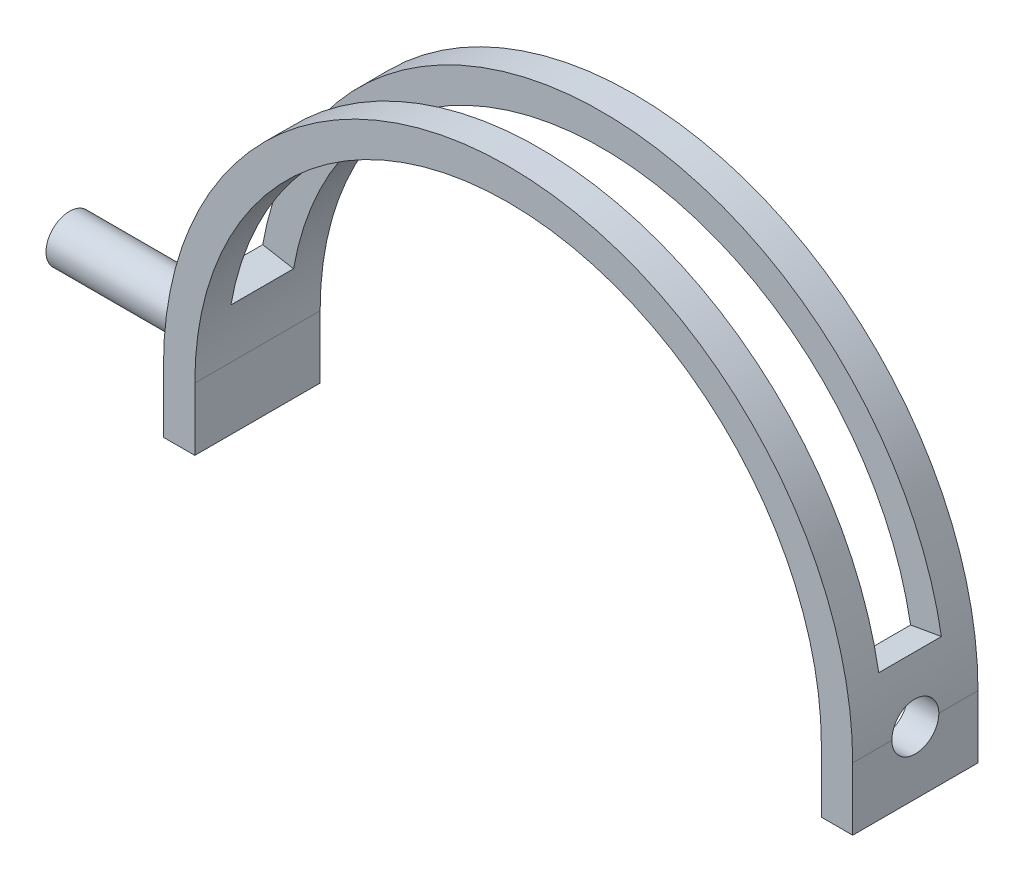
ISO-10303-21;
HEADER;
FILE_DESCRIPTION(('STEP AP214'),'2;1');
FILE_NAME('part.step','',(''),(''),'','','');
FILE_SCHEMA(('AUTOMOTIVE_DESIGN { 1 0 10303 214 1 1 1 1 }'));
ENDSEC;
DATA;
#1=APPLICATION_CONTEXT('core data for automotive mechanical design processes');
#2=APPLICATION_PROTOCOL_DEFINITION('international standard','automotive_design',2000,#1);
#3=PRODUCT_CONTEXT('',#1,'mechanical');
#4=PRODUCT('Part','Part','',(#3));
#5=PRODUCT_RELATED_PRODUCT_CATEGORY('part','',(#4));
#6=PRODUCT_DEFINITION_FORMATION('','',#4);
#7=PRODUCT_DEFINITION_CONTEXT('part definition',#1,'design');
#8=PRODUCT_DEFINITION('design','',#6,#7);
#9=PRODUCT_DEFINITION_SHAPE('','',#8);
#10=(LENGTH_UNIT() NAMED_UNIT(*) SI_UNIT(.MILLI.,.METRE.));
#11=(NAMED_UNIT(*) PLANE_ANGLE_UNIT() SI_UNIT($,.RADIAN.));
#12=(NAMED_UNIT(*) SI_UNIT($,.STERADIAN.) SOLID_ANGLE_UNIT());
#13=UNCERTAINTY_MEASURE_WITH_UNIT(LENGTH_MEASURE(1.E-05),#10,'distance_accuracy_value','');
#14=(GEOMETRIC_REPRESENTATION_CONTEXT(3) GLOBAL_UNCERTAINTY_ASSIGNED_CONTEXT((#13)) GLOBAL_UNIT_ASSIGNED_CONTEXT((#10,
#11,#12)) REPRESENTATION_CONTEXT('',''));
#15=CARTESIAN_POINT('',(0.,0.,0.));
#16=DIRECTION('',(0.,0.,1.));
#17=DIRECTION('',(1.,0.,0.));
#18=AXIS2_PLACEMENT_3D('',#15,#16,#17);
#19=CARTESIAN_POINT('',(-50.,-10.,-10.));
#20=DIRECTION('',(1.,0.,0.));
#21=DIRECTION('',(0.,1.,0.));
#22=AXIS2_PLACEMENT_3D('',#19,#20,#21);
#23=PLANE('',#22);
#24=DIRECTION('',(0.,0.,1.));
#25=VECTOR('',#24,1.);
#26=CARTESIAN_POINT('',(-50.,0.,-10.));
#27=LINE('',#26,#25);
#28=CARTESIAN_POINT('',(-50.,0.,-10.));
#29=VERTEX_POINT('',#28);
#30=CARTESIAN_POINT('',(-50.,0.,10.));
#31=VERTEX_POINT('',#30);
#32=EDGE_CURVE('E175',#29,#31,#27,.T.);
#33=ORIENTED_EDGE('',*,*,#32,.T.);
#34=DIRECTION('',(0.,1.,0.));
#35=VECTOR('',#34,1.);
#36=CARTESIAN_POINT('',(-50.,-10.,10.));
#37=LINE('',#36,#35);
#38=CARTESIAN_POINT('',(-50.,-10.,10.));
#39=VERTEX_POINT('',#38);
#40=EDGE_CURVE('E232',#39,#31,#37,.T.);
#41=ORIENTED_EDGE('',*,*,#40,.F.);
#42=DIRECTION('',(0.,0.,1.));
#43=VECTOR('',#42,1.);
#44=CARTESIAN_POINT('',(-50.,-10.,-10.));
#45=LINE('',#44,#43);
#46=CARTESIAN_POINT('',(-50.,-10.,-10.));
#47=VERTEX_POINT('',#46);
#48=EDGE_CURVE('E182',#47,#39,#45,.T.);
#49=ORIENTED_EDGE('',*,*,#48,.F.);
#50=DIRECTION('',(0.,1.,0.));
#51=VECTOR('',#50,1.);
#52=CARTESIAN_POINT('',(-50.,-10.,-10.));
#53=LINE('',#52,#51);
#54=EDGE_CURVE('E256',#47,#29,#53,.T.);
#55=ORIENTED_EDGE('',*,*,#54,.T.);
#56=EDGE_LOOP('',(#33,#41,#49,#55));
#57=FACE_BOUND('',#56,.T.);
#58=ADVANCED_FACE('F34',(#57),#23,.T.);
#59=CARTESIAN_POINT('',(-55.,-10.,-10.));
#60=DIRECTION('',(0.,-1.,0.));
#61=DIRECTION('',(0.,0.,-1.));
#62=AXIS2_PLACEMENT_3D('',#59,#60,#61);
#63=PLANE('',#62);
#64=ORIENTED_EDGE('',*,*,#48,.T.);
#65=DIRECTION('',(1.,0.,0.));
#66=VECTOR('',#65,1.);
#67=CARTESIAN_POINT('',(-55.,-10.,10.));
#68=LINE('',#67,#66);
#69=CARTESIAN_POINT('',(-55.,-10.,10.));
#70=VERTEX_POINT('',#69);
#71=EDGE_CURVE('E253',#70,#39,#68,.T.);
#72=ORIENTED_EDGE('',*,*,#71,.F.);
#73=DIRECTION('',(0.,0.,1.));
#74=VECTOR('',#73,1.);
#75=CARTESIAN_POINT('',(-55.,-10.,-10.));
#76=LINE('',#75,#74);
#77=CARTESIAN_POINT('',(-55.,-10.,-10.));
#78=VERTEX_POINT('',#77);
#79=EDGE_CURVE('E276',#78,#70,#76,.T.);
#80=ORIENTED_EDGE('',*,*,#79,.F.);
#81=DIRECTION('',(1.,0.,0.));
#82=VECTOR('',#81,1.);
#83=CARTESIAN_POINT('',(-55.,-10.,-10.));
#84=LINE('',#83,#82);
#85=EDGE_CURVE('E177',#78,#47,#84,.T.);
#86=ORIENTED_EDGE('',*,*,#85,.T.);
#87=EDGE_LOOP('',(#64,#72,#80,#86));
#88=FACE_BOUND('',#87,.T.);
#89=ADVANCED_FACE('F296',(#88),#63,.T.);
#90=CARTESIAN_POINT('',(-55.,0.,-10.));
#91=DIRECTION('',(-1.,0.,0.));
#92=DIRECTION('',(0.,0.,1.));
#93=AXIS2_PLACEMENT_3D('',#90,#91,#92);
#94=PLANE('',#93);
#95=DIRECTION('',(0.,0.,1.));
#96=VECTOR('',#95,1.);
#97=CARTESIAN_POINT('',(-55.,0.,-10.));
#98=LINE('',#97,#96);
#99=CARTESIAN_POINT('',(-55.,0.,3.75));
#100=VERTEX_POINT('',#99);
#101=CARTESIAN_POINT('',(-55.,0.,10.));
#102=VERTEX_POINT('',#101);
#103=EDGE_CURVE('E160',#100,#102,#98,.T.);
#104=ORIENTED_EDGE('',*,*,#103,.F.);
#105=CARTESIAN_POINT('',(-55.,0.,0.));
#106=DIRECTION('',(-1.,0.,0.));
#107=DIRECTION('',(0.,0.,1.));
#108=AXIS2_PLACEMENT_3D('',#105,#106,#107);
#109=CIRCLE('',#108,3.75);
#110=CARTESIAN_POINT('',(-55.,0.,-3.75));
#111=VERTEX_POINT('',#110);
#112=EDGE_CURVE('E154',#111,#100,#109,.T.);
#113=ORIENTED_EDGE('',*,*,#112,.F.);
#114=CARTESIAN_POINT('',(-55.,0.,-10.));
#115=VERTEX_POINT('',#114);
#116=EDGE_CURVE('E164',#115,#111,#98,.T.);
#117=ORIENTED_EDGE('',*,*,#116,.F.);
#118=DIRECTION('',(0.,-1.,0.));
#119=VECTOR('',#118,1.);
#120=CARTESIAN_POINT('',(-55.,0.,-10.));
#121=LINE('',#120,#119);
#122=EDGE_CURVE('E271',#115,#78,#121,.T.);
#123=ORIENTED_EDGE('',*,*,#122,.T.);
#124=ORIENTED_EDGE('',*,*,#79,.T.);
#125=DIRECTION('',(0.,-1.,0.));
#126=VECTOR('',#125,1.);
#127=CARTESIAN_POINT('',(-55.,0.,10.));
#128=LINE('',#127,#126);
#129=EDGE_CURVE('E250',#102,#70,#128,.T.);
#130=ORIENTED_EDGE('',*,*,#129,.F.);
#131=EDGE_LOOP('',(#104,#113,#117,#123,#124,#130));
#132=FACE_BOUND('',#131,.T.);
#133=ADVANCED_FACE('F289',(#132),#94,.T.);
#134=CARTESIAN_POINT('',(0.,0.,-10.));
#135=DIRECTION('',(0.,0.,1.));
#136=DIRECTION('',(1.,0.,0.));
#137=AXIS2_PLACEMENT_3D('',#134,#135,#136);
#138=CYLINDRICAL_SURFACE('',#137,55.);
#139=CARTESIAN_POINT('',(55.,-1.95399252334028E-13,-3.75));
#140=CARTESIAN_POINT('',(55.0000029367142,0.105342142935318,-3.75001024623835));
#141=CARTESIAN_POINT('',(54.9996974169464,0.210679329031992,-3.74556125983305));
#142=CARTESIAN_POINT('',(54.9984911560112,0.420597692397046,-3.72782413932973));
#143=CARTESIAN_POINT('',(54.9975904484224,0.525178911978168,-3.7145365038797));
#144=CARTESIAN_POINT('',(54.9952164461705,0.732768463109257,-3.67921548066589));
#145=CARTESIAN_POINT('',(54.9937436088666,0.83577798288623,-3.65718907835464));
#146=CARTESIAN_POINT('',(54.9902695969715,1.0395457592481,-3.60457109820449));
#147=CARTESIAN_POINT('',(54.9882684278441,1.14030403910268,-3.57397960894191));
#148=CARTESIAN_POINT('',(54.9815497006618,1.43821968222911,-3.46961207792658));
#149=CARTESIAN_POINT('',(54.9761157415531,1.6311144615404,-3.38322644205145));
#150=CARTESIAN_POINT('',(54.963951772662,1.99952668733934,-3.17942887631531));
#151=CARTESIAN_POINT('',(54.9572219719461,2.17504693006789,-3.0620219501866));
#152=CARTESIAN_POINT('',(54.9432089953261,2.50419161022359,-2.79926858129625));
#153=CARTESIAN_POINT('',(54.9359250240775,2.65778363165163,-2.65388150599399));
#154=CARTESIAN_POINT('',(54.9216307209085,2.93841559287571,-2.33936936328912));
#155=CARTESIAN_POINT('',(54.914620430834,3.06545148507258,-2.17024068382497));
#156=CARTESIAN_POINT('',(54.9016584325678,3.28945974103843,-1.81286154174951));
#157=CARTESIAN_POINT('',(54.8957077258553,3.38640372668274,-1.62459325028223));
#158=CARTESIAN_POINT('',(54.8855472218615,3.54728664535595,-1.23441668760156));
#159=CARTESIAN_POINT('',(54.8813372964711,3.61122800722962,-1.03250942139259));
#160=CARTESIAN_POINT('',(54.8751406395362,3.70420438031895,-0.621107551006494));
#161=CARTESIAN_POINT('',(54.8731504707955,3.73329336411869,-0.411625197340026));
#162=CARTESIAN_POINT('',(54.8716074701609,3.75590582911842,0.00926286808655241));
#163=CARTESIAN_POINT('',(54.8720546662752,3.74942890162516,0.220668601920645));
#164=CARTESIAN_POINT('',(54.8753328587618,3.7011369478326,0.639022415430742));
#165=CARTESIAN_POINT('',(54.87815984068,3.65938143245418,0.845977400499929));
#166=CARTESIAN_POINT('',(54.8858727077681,3.54181004937536,1.24993319922138));
#167=CARTESIAN_POINT('',(54.8907585977356,3.46599410230701,1.4469339896771));
#168=CARTESIAN_POINT('',(54.902043441865,3.28238497913749,1.82558488844642));
#169=CARTESIAN_POINT('',(54.9084437002839,3.17456421825019,2.00722158027716));
#170=CARTESIAN_POINT('',(54.9220343842251,2.93003108367319,2.34983203424323));
#171=CARTESIAN_POINT('',(54.9292247833342,2.79331967561327,2.51080648669624));
#172=CARTESIAN_POINT('',(54.9436025499965,2.49457344691883,2.80785749024394));
#173=CARTESIAN_POINT('',(54.950789885539,2.33249076604471,2.94388590808845));
#174=CARTESIAN_POINT('',(54.9643407818936,1.98770023944715,3.186852193666));
#175=CARTESIAN_POINT('',(54.9707040858688,1.80498599626443,3.29378100291514));
#176=CARTESIAN_POINT('',(54.9818912676378,1.42406572896318,3.47550441137062));
#177=CARTESIAN_POINT('',(54.9867141205136,1.2258494995153,3.5502776277038));
#178=CARTESIAN_POINT('',(54.9942631870291,0.819787574609469,3.66535604525424));
#179=CARTESIAN_POINT('',(54.9969925870056,0.611957025939463,3.70571363922976));
#180=CARTESIAN_POINT('',(54.9990174006614,0.335592543259283,3.73556310688761));
#181=CARTESIAN_POINT('',(54.9993856713141,0.268529650779384,3.74097972741535));
#182=CARTESIAN_POINT('',(54.9998766533153,0.134320349224248,3.74819325338534));
#183=CARTESIAN_POINT('',(54.9999997721051,0.0671742646229812,3.74999616482954));
#184=CARTESIAN_POINT('',(55.,-1.95257758412544E-13,3.75));
#185=B_SPLINE_CURVE_WITH_KNOTS('',3,(#139,#140,#141,#142,#143,#144,#145,#146,#147,#148,#149,
#150,#151,#152,#153,#154,#155,#156,#157,#158,#159,#160,#161,#162,#163,#164,#165,#166,#167,#168,
#169,#170,#171,#172,#173,#174,#175,#176,#177,#178,#179,#180,#181,#182,#183,#184),.UNSPECIFIED.,
.F.,.F.,(4,2,2,2,2,2,2,2,2,2,2,2,2,2,2,2,2,2,2,2,2,2,4),(0.,0.315923170469204,0.631828519085877,
0.947481851605208,1.26313191989822,1.89414168946421,2.52504973926065,3.15688099779294,
3.78880848789663,4.42133011828181,5.05380519127802,5.68529953868014,6.31680114269417,
6.94723959813432,7.57767952263571,8.2086644057043,8.83962820231382,9.47179691738327,
10.1041621971843,10.7369473403606,11.3687674320507,11.5705452203006,11.7719873738926),.UNSPECIFIED.);
#186=CARTESIAN_POINT('',(55.,-1.95399252334028E-13,-3.75));
#187=VERTEX_POINT('',#186);
#188=CARTESIAN_POINT('',(55.,-1.95399252334028E-13,3.75));
#189=VERTEX_POINT('',#188);
#190=EDGE_CURVE('E51',#187,#189,#185,.T.);
#191=ORIENTED_EDGE('',*,*,#190,.F.);
#192=DIRECTION('',(0.,0.,1.));
#193=VECTOR('',#192,1.);
#194=CARTESIAN_POINT('',(55.,-1.95399252334028E-13,-10.));
#195=LINE('',#194,#193);
#196=CARTESIAN_POINT('',(55.,-1.95399252334028E-13,-10.));
#197=VERTEX_POINT('',#196);
#198=EDGE_CURVE('E150',#197,#187,#195,.T.);
#199=ORIENTED_EDGE('',*,*,#198,.F.);
#200=CARTESIAN_POINT('',(0.,0.,-10.));
#201=DIRECTION('',(0.,0.,1.));
#202=DIRECTION('',(1.,0.,0.));
#203=AXIS2_PLACEMENT_3D('',#200,#201,#202);
#204=CIRCLE('',#203,55.);
#205=EDGE_CURVE('E269',#197,#115,#204,.T.);
#206=ORIENTED_EDGE('',*,*,#205,.T.);
#207=ORIENTED_EDGE('',*,*,#116,.T.);
#208=EDGE_CURVE('E162',#111,#100,#98,.T.);
#209=ORIENTED_EDGE('',*,*,#208,.T.);
#210=ORIENTED_EDGE('',*,*,#103,.T.);
#211=CARTESIAN_POINT('',(0.,0.,10.));
#212=DIRECTION('',(0.,0.,1.));
#213=DIRECTION('',(1.,0.,0.));
#214=AXIS2_PLACEMENT_3D('',#211,#212,#213);
#215=CIRCLE('',#214,55.);
#216=CARTESIAN_POINT('',(55.,-1.95399252334028E-13,10.));
#217=VERTEX_POINT('',#216);
#218=EDGE_CURVE('E247',#217,#102,#215,.T.);
#219=ORIENTED_EDGE('',*,*,#218,.F.);
#220=EDGE_CURVE('E153',#189,#217,#195,.T.);
#221=ORIENTED_EDGE('',*,*,#220,.F.);
#222=EDGE_LOOP('',(#191,#199,#206,#207,#209,#210,#219,#221));
#223=FACE_BOUND('',#222,.T.);
#224=CARTESIAN_POINT('',(0.,0.,5.));
#225=DIRECTION('',(0.,0.,1.));
#226=DIRECTION('',(1.,0.,0.));
#227=AXIS2_PLACEMENT_3D('',#224,#225,#226);
#228=CIRCLE('',#227,55.);
#229=CARTESIAN_POINT('',(54.1644264156715,9.5506497716808,5.));
#230=VERTEX_POINT('',#229);
#231=CARTESIAN_POINT('',(-54.1644264156715,9.55064977168079,5.));
#232=VERTEX_POINT('',#231);
#233=EDGE_CURVE('E204',#230,#232,#228,.T.);
#234=ORIENTED_EDGE('',*,*,#233,.T.);
#235=DIRECTION('',(0.,0.,-1.));
#236=VECTOR('',#235,1.);
#237=CARTESIAN_POINT('',(-54.1644264156715,9.55064977168079,5.));
#238=LINE('',#237,#236);
#239=CARTESIAN_POINT('',(-54.1644264156715,9.55064977168079,-5.));
#240=VERTEX_POINT('',#239);
#241=EDGE_CURVE('E203',#232,#240,#238,.T.);
#242=ORIENTED_EDGE('',*,*,#241,.T.);
#243=CARTESIAN_POINT('',(0.,0.,-5.));
#244=DIRECTION('',(0.,0.,1.));
#245=DIRECTION('',(1.,0.,0.));
#246=AXIS2_PLACEMENT_3D('',#243,#244,#245);
#247=CIRCLE('',#246,55.);
#248=CARTESIAN_POINT('',(54.1644264156715,9.55064977168081,-5.));
#249=VERTEX_POINT('',#248);
#250=EDGE_CURVE('E218',#249,#240,#247,.T.);
#251=ORIENTED_EDGE('',*,*,#250,.F.);
#252=DIRECTION('',(0.,0.,-1.));
#253=VECTOR('',#252,1.);
#254=CARTESIAN_POINT('',(54.1644264156715,9.5506497716808,5.));
#255=LINE('',#254,#253);
#256=EDGE_CURVE('E217',#230,#249,#255,.T.);
#257=ORIENTED_EDGE('',*,*,#256,.F.);
#258=EDGE_LOOP('',(#234,#242,#251,#257));
#259=FACE_BOUND('',#258,.T.);
#260=ADVANCED_FACE('F147',(#223,#259),#138,.T.);
#261=CARTESIAN_POINT('',(55.,-1.88663694938717E-13,-10.));
#262=DIRECTION('',(1.,0.,0.));
#263=DIRECTION('',(0.,1.,0.));
#264=AXIS2_PLACEMENT_3D('',#261,#262,#263);
#265=PLANE('',#264);
#266=CARTESIAN_POINT('',(55.,-1.90819582357449E-13,0.));
#267=DIRECTION('',(1.,0.,0.));
#268=DIRECTION('',(0.,1.,0.));
#269=AXIS2_PLACEMENT_3D('',#266,#267,#268);
#270=CIRCLE('',#269,3.75);
#271=EDGE_CURVE('E140',#189,#187,#270,.T.);
#272=ORIENTED_EDGE('',*,*,#271,.F.);
#273=ORIENTED_EDGE('',*,*,#220,.T.);
#274=DIRECTION('',(0.,1.,0.));
#275=VECTOR('',#274,1.);
#276=CARTESIAN_POINT('',(55.,-1.88663694938717E-13,10.));
#277=LINE('',#276,#275);
#278=CARTESIAN_POINT('',(55.,-10.0000000000002,10.));
#279=VERTEX_POINT('',#278);
#280=EDGE_CURVE('E244',#279,#217,#277,.T.);
#281=ORIENTED_EDGE('',*,*,#280,.F.);
#282=DIRECTION('',(0.,0.,1.));
#283=VECTOR('',#282,1.);
#284=CARTESIAN_POINT('',(55.,-10.0000000000002,-10.));
#285=LINE('',#284,#283);
#286=CARTESIAN_POINT('',(55.,-10.0000000000002,-10.));
#287=VERTEX_POINT('',#286);
#288=EDGE_CURVE('E165',#287,#279,#285,.T.);
#289=ORIENTED_EDGE('',*,*,#288,.F.);
#290=DIRECTION('',(0.,1.,0.));
#291=VECTOR('',#290,1.);
#292=CARTESIAN_POINT('',(55.,-1.88663694938717E-13,-10.));
#293=LINE('',#292,#291);
#294=EDGE_CURVE('E159',#287,#197,#293,.T.);
#295=ORIENTED_EDGE('',*,*,#294,.T.);
#296=ORIENTED_EDGE('',*,*,#198,.T.);
#297=EDGE_LOOP('',(#272,#273,#281,#289,#295,#296));
#298=FACE_BOUND('',#297,.T.);
#299=ADVANCED_FACE('F157',(#298),#265,.T.);
#300=CARTESIAN_POINT('',(55.,-10.0000000000002,-10.));
#301=DIRECTION('',(0.,-1.,0.));
#302=DIRECTION('',(1.,0.,0.));
#303=AXIS2_PLACEMENT_3D('',#300,#301,#302);
#304=PLANE('',#303);
#305=ORIENTED_EDGE('',*,*,#288,.T.);
#306=DIRECTION('',(1.,0.,0.));
#307=VECTOR('',#306,1.);
#308=CARTESIAN_POINT('',(55.,-10.0000000000002,10.));
#309=LINE('',#308,#307);
#310=CARTESIAN_POINT('',(50.,-10.0000000000002,10.));
#311=VERTEX_POINT('',#310);
#312=EDGE_CURVE('E241',#311,#279,#309,.T.);
#313=ORIENTED_EDGE('',*,*,#312,.F.);
#314=DIRECTION('',(0.,0.,1.));
#315=VECTOR('',#314,1.);
#316=CARTESIAN_POINT('',(50.,-10.0000000000002,-10.));
#317=LINE('',#316,#315);
#318=CARTESIAN_POINT('',(50.,-10.0000000000002,-10.));
#319=VERTEX_POINT('',#318);
#320=EDGE_CURVE('E169',#319,#311,#317,.T.);
#321=ORIENTED_EDGE('',*,*,#320,.F.);
#322=DIRECTION('',(1.,0.,0.));
#323=VECTOR('',#322,1.);
#324=CARTESIAN_POINT('',(55.,-10.0000000000002,-10.));
#325=LINE('',#324,#323);
#326=EDGE_CURVE('E265',#319,#287,#325,.T.);
#327=ORIENTED_EDGE('',*,*,#326,.T.);
#328=EDGE_LOOP('',(#305,#313,#321,#327));
#329=FACE_BOUND('',#328,.T.);
#330=ADVANCED_FACE('F313',(#329),#304,.T.);
#331=CARTESIAN_POINT('',(50.,-10.0000000000002,-10.));
#332=DIRECTION('',(-1.,0.,0.));
#333=DIRECTION('',(0.,-1.,0.));
#334=AXIS2_PLACEMENT_3D('',#331,#332,#333);
#335=PLANE('',#334);
#336=CARTESIAN_POINT('',(50.,-1.73472347597681E-13,0.));
#337=DIRECTION('',(-1.,0.,0.));
#338=DIRECTION('',(0.,-1.,0.));
#339=AXIS2_PLACEMENT_3D('',#336,#337,#338);
#340=CIRCLE('',#339,3.75);
#341=CARTESIAN_POINT('',(50.,-1.77635683940025E-13,-3.75));
#342=VERTEX_POINT('',#341);
#343=CARTESIAN_POINT('',(50.,-1.65389215948552E-13,3.75));
#344=VERTEX_POINT('',#343);
#345=EDGE_CURVE('E57',#342,#344,#340,.T.);
#346=ORIENTED_EDGE('',*,*,#345,.F.);
#347=DIRECTION('',(0.,0.,1.));
#348=VECTOR('',#347,1.);
#349=CARTESIAN_POINT('',(50.,-1.65389215948552E-13,-10.));
#350=LINE('',#349,#348);
#351=CARTESIAN_POINT('',(50.,-1.65389215948552E-13,-10.));
#352=VERTEX_POINT('',#351);
#353=EDGE_CURVE('E171',#352,#342,#350,.T.);
#354=ORIENTED_EDGE('',*,*,#353,.F.);
#355=DIRECTION('',(0.,-1.,0.));
#356=VECTOR('',#355,1.);
#357=CARTESIAN_POINT('',(50.,-10.0000000000002,-10.));
#358=LINE('',#357,#356);
#359=EDGE_CURVE('E262',#352,#319,#358,.T.);
#360=ORIENTED_EDGE('',*,*,#359,.T.);
#361=ORIENTED_EDGE('',*,*,#320,.T.);
#362=DIRECTION('',(0.,-1.,0.));
#363=VECTOR('',#362,1.);
#364=CARTESIAN_POINT('',(50.,-10.0000000000002,10.));
#365=LINE('',#364,#363);
#366=CARTESIAN_POINT('',(50.,-1.65389215948552E-13,10.));
#367=VERTEX_POINT('',#366);
#368=EDGE_CURVE('E238',#367,#311,#365,.T.);
#369=ORIENTED_EDGE('',*,*,#368,.F.);
#370=EDGE_CURVE('E174',#344,#367,#350,.T.);
#371=ORIENTED_EDGE('',*,*,#370,.F.);
#372=EDGE_LOOP('',(#346,#354,#360,#361,#369,#371));
#373=FACE_BOUND('',#372,.T.);
#374=ADVANCED_FACE('F311',(#373),#335,.T.);
#375=CARTESIAN_POINT('',(0.,0.,-10.));
#376=DIRECTION('',(0.,0.,1.));
#377=DIRECTION('',(1.,0.,0.));
#378=AXIS2_PLACEMENT_3D('',#375,#376,#377);
#379=CYLINDRICAL_SURFACE('',#378,50.);
#380=CARTESIAN_POINT('',(50.,-1.77635683940025E-13,3.75));
#381=CARTESIAN_POINT('',(50.0000032276236,0.105314917236522,3.75001027591296));
#382=CARTESIAN_POINT('',(49.9996673307288,0.210624843433596,3.74556355620653));
#383=CARTESIAN_POINT('',(49.9983411299638,0.420488383553519,3.72783567687368));
#384=CARTESIAN_POINT('',(49.9973508641763,0.525042041131549,3.71455503136163));
#385=CARTESIAN_POINT('',(49.9947408299382,0.732574269354693,3.67925327176541));
#386=CARTESIAN_POINT('',(49.9931215768308,0.83555405789977,3.65723931276511));
#387=CARTESIAN_POINT('',(49.9893021908466,1.03926261056971,3.60465179488132));
#388=CARTESIAN_POINT('',(49.9871020637575,1.13999139711252,3.57407832128391));
#389=CARTESIAN_POINT('',(49.9797153249667,1.43781777695487,3.46977437288199));
#390=CARTESIAN_POINT('',(49.9737410327524,1.63065378647505,3.38344353794966));
#391=CARTESIAN_POINT('',(49.9603667618087,1.99896044759581,3.17977979302779));
#392=CARTESIAN_POINT('',(49.952967002609,2.17443376685514,3.06245165576005));
#393=CARTESIAN_POINT('',(49.9375551733729,2.50355506967491,2.7998363346347));
#394=CARTESIAN_POINT('',(49.9295420460268,2.65716399892456,2.6545001858007));
#395=CARTESIAN_POINT('',(49.9138147856466,2.93784240020075,2.3400872243826));
#396=CARTESIAN_POINT('',(49.9061006983538,3.06490782506818,2.17100679800767));
#397=CARTESIAN_POINT('',(49.8918336359548,3.28901243927893,1.81367604038529));
#398=CARTESIAN_POINT('',(49.885282005738,3.38601694562089,1.6254038967803));
#399=CARTESIAN_POINT('',(49.8740937439797,3.54701630814919,1.23519916942489));
#400=CARTESIAN_POINT('',(49.869456967595,3.61101366115077,1.03326762024322));
#401=CARTESIAN_POINT('',(49.8626315149783,3.70407532160279,0.621867822294222));
#402=CARTESIAN_POINT('',(49.8604382550025,3.73320504421124,0.41241444839164));
#403=CARTESIAN_POINT('',(49.8587334614625,3.75590653586881,-0.00842466993697367));
#404=CARTESIAN_POINT('',(49.859221952209,3.74947798257343,-0.219810431863234));
#405=CARTESIAN_POINT('',(49.8628214134207,3.70129828860962,-0.63805502179087));
#406=CARTESIAN_POINT('',(49.8659270382831,3.65961914806862,-0.844922196252313));
#407=CARTESIAN_POINT('',(49.8744024047805,3.54223357496316,-1.2487151543327));
#408=CARTESIAN_POINT('',(49.8797721542701,3.46652702435238,-1.44564090346068));
#409=CARTESIAN_POINT('',(49.8921769833295,3.28315187194229,-1.8241962245246));
#410=CARTESIAN_POINT('',(49.8992137868306,3.1754501538729,-2.00580969636857));
#411=CARTESIAN_POINT('',(49.9141577319368,2.93117461984818,-2.34839905755384));
#412=CARTESIAN_POINT('',(49.9220648473314,2.79460167327391,-2.50937556808849));
#413=CARTESIAN_POINT('',(49.9378813652682,2.49606390222459,-2.80653055948815));
#414=CARTESIAN_POINT('',(49.9457907298473,2.33404039512812,-2.94265011764086));
#415=CARTESIAN_POINT('',(49.960705339194,1.98938916964039,-3.18580456692301));
#416=CARTESIAN_POINT('',(49.9677103033573,1.80675508927845,-3.2928304426155));
#417=CARTESIAN_POINT('',(49.9800287454976,1.42580718296324,-3.47477925960988));
#418=CARTESIAN_POINT('',(49.9853410704953,1.22748278350028,-3.54968033034545));
#419=CARTESIAN_POINT('',(49.9915839410095,0.923002116437693,-3.63617123418886));
#420=CARTESIAN_POINT('',(49.9933771150552,0.820363397546247,-3.66068917669601));
#421=CARTESIAN_POINT('',(49.996344115919,0.613389784995992,-3.70099214173126));
#422=CARTESIAN_POINT('',(49.9975182452601,0.509055745574236,-3.71678143007673));
#423=CARTESIAN_POINT('',(49.9989089319457,0.337086661053192,-3.73543088598495));
#424=CARTESIAN_POINT('',(49.9993179319099,0.269722430696705,-3.74089763021941));
#425=CARTESIAN_POINT('',(49.9998634344596,0.13490831909474,-3.74817934704066));
#426=CARTESIAN_POINT('',(50.0000003897131,0.0674587673137052,-3.75000038592534));
#427=CARTESIAN_POINT('',(50.,-1.77602805925009E-13,-3.75));
#428=B_SPLINE_CURVE_WITH_KNOTS('',3,(#380,#381,#382,#383,#384,#385,#386,#387,#388,#389,#390,
#391,#392,#393,#394,#395,#396,#397,#398,#399,#400,#401,#402,#403,#404,#405,#406,#407,#408,#409,
#410,#411,#412,#413,#414,#415,#416,#417,#418,#419,#420,#421,#422,#423,#424,#425,#426,#427),
.UNSPECIFIED.,.F.,.F.,(4,2,2,2,2,2,2,2,2,2,2,2,2,2,2,2,2,2,2,2,2,2,2,4),(0.,0.315841418928883,
0.631664458214924,0.94722928061864,1.26279095888019,1.89361858516879,2.52434913811097,
3.15619253577542,3.78813220208867,4.42079828191643,5.0534164969052,5.68484598730975,
6.31628120178712,6.94642980149133,7.5765805872949,8.20738589025569,8.83817220088009,
9.47043489412273,10.1028932877032,10.7357815780942,11.0521034613033,11.3682706165378,
11.5709413889701,11.7732746446698),.UNSPECIFIED.);
#429=EDGE_CURVE('E11',#344,#342,#428,.T.);
#430=ORIENTED_EDGE('',*,*,#429,.F.);
#431=ORIENTED_EDGE('',*,*,#370,.T.);
#432=CARTESIAN_POINT('',(0.,0.,10.));
#433=DIRECTION('',(0.,0.,-1.));
#434=DIRECTION('',(1.,0.,0.));
#435=AXIS2_PLACEMENT_3D('',#432,#433,#434);
#436=CIRCLE('',#435,50.);
#437=EDGE_CURVE('E235',#31,#367,#436,.T.);
#438=ORIENTED_EDGE('',*,*,#437,.F.);
#439=ORIENTED_EDGE('',*,*,#32,.F.);
#440=CARTESIAN_POINT('',(0.,0.,-10.));
#441=DIRECTION('',(0.,0.,-1.));
#442=DIRECTION('',(1.,0.,0.));
#443=AXIS2_PLACEMENT_3D('',#440,#441,#442);
#444=CIRCLE('',#443,50.);
#445=EDGE_CURVE('E259',#29,#352,#444,.T.);
#446=ORIENTED_EDGE('',*,*,#445,.T.);
#447=ORIENTED_EDGE('',*,*,#353,.T.);
#448=EDGE_LOOP('',(#430,#431,#438,#439,#446,#447));
#449=FACE_BOUND('',#448,.T.);
#450=CARTESIAN_POINT('',(0.,0.,5.));
#451=DIRECTION('',(0.,0.,1.));
#452=DIRECTION('',(1.,0.,0.));
#453=AXIS2_PLACEMENT_3D('',#450,#451,#452);
#454=CIRCLE('',#453,50.);
#455=CARTESIAN_POINT('',(49.2403876506105,8.68240888334619,5.));
#456=VERTEX_POINT('',#455);
#457=CARTESIAN_POINT('',(-49.2403876506105,8.68240888334618,5.));
#458=VERTEX_POINT('',#457);
#459=EDGE_CURVE('E45',#456,#458,#454,.T.);
#460=ORIENTED_EDGE('',*,*,#459,.F.);
#461=DIRECTION('',(0.,0.,1.));
#462=VECTOR('',#461,1.);
#463=CARTESIAN_POINT('',(49.2403876506105,8.68240888334619,-10.));
#464=LINE('',#463,#462);
#465=CARTESIAN_POINT('',(49.2403876506105,8.68240888334619,-5.));
#466=VERTEX_POINT('',#465);
#467=EDGE_CURVE('E185',#456,#466,#464,.F.);
#468=ORIENTED_EDGE('',*,*,#467,.T.);
#469=CARTESIAN_POINT('',(0.,0.,-5.));
#470=DIRECTION('',(0.,0.,1.));
#471=DIRECTION('',(1.,0.,0.));
#472=AXIS2_PLACEMENT_3D('',#469,#470,#471);
#473=CIRCLE('',#472,50.);
#474=CARTESIAN_POINT('',(-49.2403876506105,8.68240888334618,-5.));
#475=VERTEX_POINT('',#474);
#476=EDGE_CURVE('E178',#466,#475,#473,.T.);
#477=ORIENTED_EDGE('',*,*,#476,.T.);
#478=DIRECTION('',(0.,0.,1.));
#479=VECTOR('',#478,1.);
#480=CARTESIAN_POINT('',(-49.2403876506105,8.68240888334618,-10.));
#481=LINE('',#480,#479);
#482=EDGE_CURVE('E181',#475,#458,#481,.T.);
#483=ORIENTED_EDGE('',*,*,#482,.T.);
#484=EDGE_LOOP('',(#460,#468,#477,#483));
#485=FACE_BOUND('',#484,.T.);
#486=ADVANCED_FACE('F206',(#449,#485),#379,.F.);
#487=CARTESIAN_POINT('',(0.,0.,-10.));
#488=DIRECTION('',(0.,0.,1.));
#489=DIRECTION('',(1.,0.,0.));
#490=AXIS2_PLACEMENT_3D('',#487,#488,#489);
#491=PLANE('',#490);
#492=ORIENTED_EDGE('',*,*,#54,.F.);
#493=ORIENTED_EDGE('',*,*,#85,.F.);
#494=ORIENTED_EDGE('',*,*,#122,.F.);
#495=ORIENTED_EDGE('',*,*,#205,.F.);
#496=ORIENTED_EDGE('',*,*,#294,.F.);
#497=ORIENTED_EDGE('',*,*,#326,.F.);
#498=ORIENTED_EDGE('',*,*,#359,.F.);
#499=ORIENTED_EDGE('',*,*,#445,.F.);
#500=EDGE_LOOP('',(#492,#493,#494,#495,#496,#497,#498,#499));
#501=FACE_BOUND('',#500,.T.);
#502=ADVANCED_FACE('F302',(#501),#491,.F.);
#503=CARTESIAN_POINT('',(0.,0.,10.));
#504=DIRECTION('',(0.,0.,1.));
#505=DIRECTION('',(1.,0.,0.));
#506=AXIS2_PLACEMENT_3D('',#503,#504,#505);
#507=PLANE('',#506);
#508=ORIENTED_EDGE('',*,*,#40,.T.);
#509=ORIENTED_EDGE('',*,*,#437,.T.);
#510=ORIENTED_EDGE('',*,*,#368,.T.);
#511=ORIENTED_EDGE('',*,*,#312,.T.);
#512=ORIENTED_EDGE('',*,*,#280,.T.);
#513=ORIENTED_EDGE('',*,*,#218,.T.);
#514=ORIENTED_EDGE('',*,*,#129,.T.);
#515=ORIENTED_EDGE('',*,*,#71,.T.);
#516=EDGE_LOOP('',(#508,#509,#510,#511,#512,#513,#514,#515));
#517=FACE_BOUND('',#516,.T.);
#518=ADVANCED_FACE('F293',(#517),#507,.T.);
#519=CARTESIAN_POINT('',(54.1644264156715,9.5506497716808,5.));
#520=DIRECTION('',(-0.173648177666924,0.984807753012209,0.));
#521=DIRECTION('',(-0.984807753012209,-0.173648177666924,0.));
#522=AXIS2_PLACEMENT_3D('',#519,#520,#521);
#523=PLANE('',#522);
#524=DIRECTION('',(0.984807753012209,0.173648177666924,0.));
#525=VECTOR('',#524,1.);
#526=CARTESIAN_POINT('',(54.1644264156715,9.5506497716808,5.));
#527=LINE('',#526,#525);
#528=EDGE_CURVE('E196',#456,#230,#527,.T.);
#529=ORIENTED_EDGE('',*,*,#528,.T.);
#530=ORIENTED_EDGE('',*,*,#256,.T.);
#531=DIRECTION('',(0.984807753012209,0.173648177666924,0.));
#532=VECTOR('',#531,1.);
#533=CARTESIAN_POINT('',(54.1644264156715,9.5506497716808,-5.));
#534=LINE('',#533,#532);
#535=EDGE_CURVE('E211',#466,#249,#534,.T.);
#536=ORIENTED_EDGE('',*,*,#535,.F.);
#537=ORIENTED_EDGE('',*,*,#467,.F.);
#538=EDGE_LOOP('',(#529,#530,#536,#537));
#539=FACE_BOUND('',#538,.T.);
#540=ADVANCED_FACE('F215',(#539),#523,.T.);
#541=CARTESIAN_POINT('',(0.,0.,5.));
#542=DIRECTION('',(0.173648177666924,0.984807753012209,0.));
#543=DIRECTION('',(-0.984807753012209,0.173648177666924,0.));
#544=AXIS2_PLACEMENT_3D('',#541,#542,#543);
#545=PLANE('',#544);
#546=DIRECTION('',(0.984807753012209,-0.173648177666924,0.));
#547=VECTOR('',#546,1.);
#548=CARTESIAN_POINT('',(0.,0.,-5.));
#549=LINE('',#548,#547);
#550=EDGE_CURVE('E213',#240,#475,#549,.T.);
#551=ORIENTED_EDGE('',*,*,#550,.F.);
#552=ORIENTED_EDGE('',*,*,#241,.F.);
#553=DIRECTION('',(0.984807753012209,-0.173648177666924,0.));
#554=VECTOR('',#553,1.);
#555=CARTESIAN_POINT('',(0.,0.,5.));
#556=LINE('',#555,#554);
#557=EDGE_CURVE('E194',#232,#458,#556,.T.);
#558=ORIENTED_EDGE('',*,*,#557,.T.);
#559=ORIENTED_EDGE('',*,*,#482,.F.);
#560=EDGE_LOOP('',(#551,#552,#558,#559));
#561=FACE_BOUND('',#560,.T.);
#562=ADVANCED_FACE('F201',(#561),#545,.T.);
#563=CARTESIAN_POINT('',(0.,0.,5.));
#564=DIRECTION('',(0.,0.,1.));
#565=DIRECTION('',(1.,0.,0.));
#566=AXIS2_PLACEMENT_3D('',#563,#564,#565);
#567=PLANE('',#566);
#568=ORIENTED_EDGE('',*,*,#459,.T.);
#569=ORIENTED_EDGE('',*,*,#557,.F.);
#570=ORIENTED_EDGE('',*,*,#233,.F.);
#571=ORIENTED_EDGE('',*,*,#528,.F.);
#572=EDGE_LOOP('',(#568,#569,#570,#571));
#573=FACE_BOUND('',#572,.T.);
#574=ADVANCED_FACE('F192',(#573),#567,.F.);
#575=CARTESIAN_POINT('',(0.,0.,-5.));
#576=DIRECTION('',(0.,0.,1.));
#577=DIRECTION('',(1.,0.,0.));
#578=AXIS2_PLACEMENT_3D('',#575,#576,#577);
#579=PLANE('',#578);
#580=ORIENTED_EDGE('',*,*,#535,.T.);
#581=ORIENTED_EDGE('',*,*,#250,.T.);
#582=ORIENTED_EDGE('',*,*,#550,.T.);
#583=ORIENTED_EDGE('',*,*,#476,.F.);
#584=EDGE_LOOP('',(#580,#581,#582,#583));
#585=FACE_BOUND('',#584,.T.);
#586=ADVANCED_FACE('F210',(#585),#579,.T.);
#587=CARTESIAN_POINT('',(-55.,0.,0.));
#588=DIRECTION('',(-1.,0.,0.));
#589=DIRECTION('',(0.,0.,1.));
#590=AXIS2_PLACEMENT_3D('',#587,#588,#589);
#591=PLANE('',#590);
#592=EDGE_CURVE('E223',#100,#111,#109,.T.);
#593=ORIENTED_EDGE('',*,*,#592,.F.);
#594=ORIENTED_EDGE('',*,*,#208,.F.);
#595=EDGE_LOOP('',(#593,#594));
#596=FACE_BOUND('',#595,.T.);
#597=ADVANCED_FACE('F284',(#596),#591,.F.);
#598=CARTESIAN_POINT('',(-80.,0.,0.));
#599=DIRECTION('',(1.,0.,0.));
#600=DIRECTION('',(0.,0.,-1.));
#601=AXIS2_PLACEMENT_3D('',#598,#599,#600);
#602=CYLINDRICAL_SURFACE('',#601,3.75);
#603=CARTESIAN_POINT('',(-80.,0.,0.));
#604=DIRECTION('',(-1.,0.,0.));
#605=DIRECTION('',(0.,0.,1.));
#606=AXIS2_PLACEMENT_3D('',#603,#604,#605);
#607=CIRCLE('',#606,3.75);
#608=CARTESIAN_POINT('',(-80.,0.,3.75));
#609=VERTEX_POINT('',#608);
#610=EDGE_CURVE('E219',#609,#609,#607,.T.);
#611=ORIENTED_EDGE('',*,*,#610,.F.);
#612=EDGE_LOOP('',(#611));
#613=FACE_BOUND('',#612,.T.);
#614=ORIENTED_EDGE('',*,*,#592,.T.);
#615=ORIENTED_EDGE('',*,*,#112,.T.);
#616=EDGE_LOOP('',(#614,#615));
#617=FACE_BOUND('',#616,.T.);
#618=ADVANCED_FACE('F288',(#613,#617),#602,.T.);
#619=CARTESIAN_POINT('',(-80.,0.,0.));
#620=DIRECTION('',(-1.,0.,0.));
#621=DIRECTION('',(0.,0.,1.));
#622=AXIS2_PLACEMENT_3D('',#619,#620,#621);
#623=PLANE('',#622);
#624=ORIENTED_EDGE('',*,*,#610,.T.);
#625=EDGE_LOOP('',(#624));
#626=FACE_BOUND('',#625,.T.);
#627=ADVANCED_FACE('F344',(#626),#623,.T.);
#628=CARTESIAN_POINT('',(30.,-1.04083408558608E-13,0.));
#629=DIRECTION('',(1.,0.,0.));
#630=DIRECTION('',(0.,1.,0.));
#631=AXIS2_PLACEMENT_3D('',#628,#629,#630);
#632=CYLINDRICAL_SURFACE('',#631,3.75);
#633=ORIENTED_EDGE('',*,*,#190,.T.);
#634=ORIENTED_EDGE('',*,*,#271,.T.);
#635=EDGE_LOOP('',(#633,#634));
#636=FACE_BOUND('',#635,.T.);
#637=ORIENTED_EDGE('',*,*,#345,.T.);
#638=ORIENTED_EDGE('',*,*,#429,.T.);
#639=EDGE_LOOP('',(#637,#638));
#640=FACE_BOUND('',#639,.T.);
#641=ADVANCED_FACE('F141',(#636,#640),#632,.F.);
#642=CLOSED_SHELL('',(#58,#89,#133,#260,#299,#330,#374,#486,#502,#518,#540,#562,#574,#586,#597,
#618,#627,#641));
#643=MANIFOLD_SOLID_BREP('B2',#642);
#644=ADVANCED_BREP_SHAPE_REPRESENTATION('',(#18,#643),#14);
#645=SHAPE_DEFINITION_REPRESENTATION(#9,#644);
ENDSEC;
END-ISO-10303-21;
